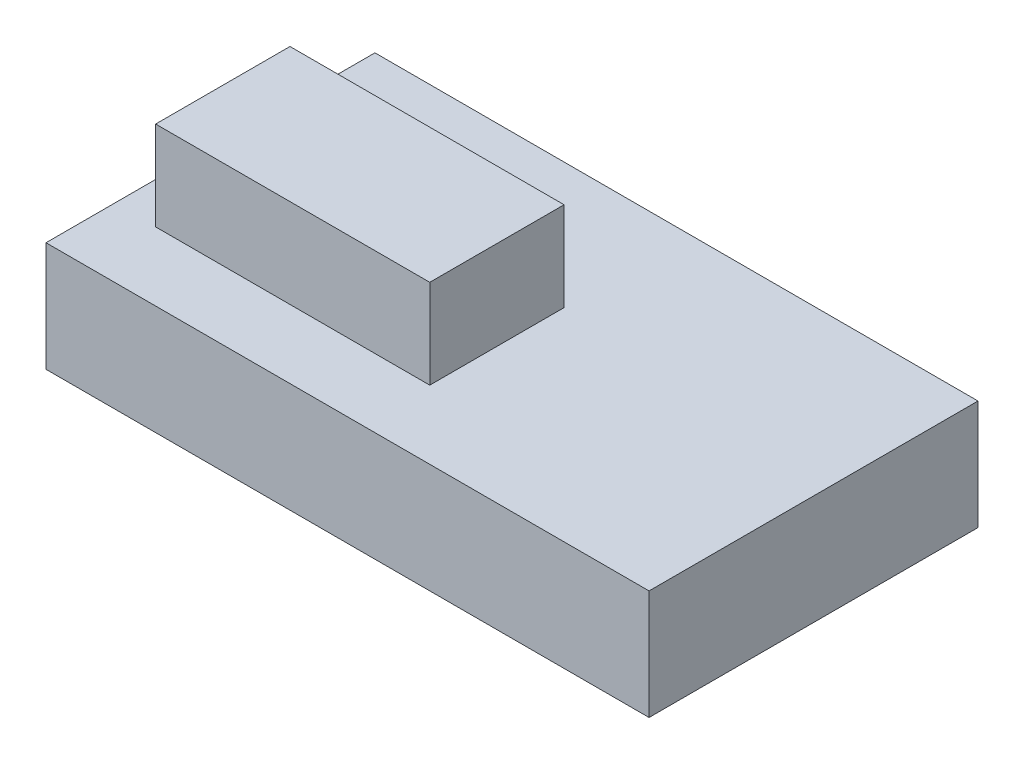
ISO-10303-21;
HEADER;
FILE_DESCRIPTION(('STEP AP214'),'2;1');
FILE_NAME('part.step','',(''),(''),'','','');
FILE_SCHEMA(('AUTOMOTIVE_DESIGN { 1 0 10303 214 1 1 1 1 }'));
ENDSEC;
DATA;
#1=APPLICATION_CONTEXT('core data for automotive mechanical design processes');
#2=APPLICATION_PROTOCOL_DEFINITION('international standard','automotive_design',2000,#1);
#3=PRODUCT_CONTEXT('',#1,'mechanical');
#4=PRODUCT('Part','Part','',(#3));
#5=PRODUCT_RELATED_PRODUCT_CATEGORY('part','',(#4));
#6=PRODUCT_DEFINITION_FORMATION('','',#4);
#7=PRODUCT_DEFINITION_CONTEXT('part definition',#1,'design');
#8=PRODUCT_DEFINITION('design','',#6,#7);
#9=PRODUCT_DEFINITION_SHAPE('','',#8);
#10=(LENGTH_UNIT() NAMED_UNIT(*) SI_UNIT(.MILLI.,.METRE.));
#11=(NAMED_UNIT(*) PLANE_ANGLE_UNIT() SI_UNIT($,.RADIAN.));
#12=(NAMED_UNIT(*) SI_UNIT($,.STERADIAN.) SOLID_ANGLE_UNIT());
#13=UNCERTAINTY_MEASURE_WITH_UNIT(LENGTH_MEASURE(1.E-05),#10,'distance_accuracy_value','');
#14=(GEOMETRIC_REPRESENTATION_CONTEXT(3) GLOBAL_UNCERTAINTY_ASSIGNED_CONTEXT((#13)) GLOBAL_UNIT_ASSIGNED_CONTEXT((#10,
#11,#12)) REPRESENTATION_CONTEXT('',''));
#15=CARTESIAN_POINT('',(0.,0.,0.));
#16=DIRECTION('',(0.,0.,1.));
#17=DIRECTION('',(1.,0.,0.));
#18=AXIS2_PLACEMENT_3D('',#15,#16,#17);
#19=CARTESIAN_POINT('',(0.,10.16,0.));
#20=DIRECTION('',(0.,1.,0.));
#21=DIRECTION('',(0.,0.,1.));
#22=AXIS2_PLACEMENT_3D('',#19,#20,#21);
#23=PLANE('',#22);
#24=DIRECTION('',(0.,0.,-1.));
#25=VECTOR('',#24,1.);
#26=CARTESIAN_POINT('',(0.,10.16,0.));
#27=LINE('',#26,#25);
#28=CARTESIAN_POINT('',(0.,10.16,0.));
#29=VERTEX_POINT('',#28);
#30=CARTESIAN_POINT('',(0.,10.16,-30.48));
#31=VERTEX_POINT('',#30);
#32=EDGE_CURVE('E150',#29,#31,#27,.T.);
#33=ORIENTED_EDGE('',*,*,#32,.T.);
#34=DIRECTION('',(-1.,0.,0.));
#35=VECTOR('',#34,1.);
#36=CARTESIAN_POINT('',(0.,10.16,-30.48));
#37=LINE('',#36,#35);
#38=CARTESIAN_POINT('',(-55.88,10.16,-30.48));
#39=VERTEX_POINT('',#38);
#40=EDGE_CURVE('E95',#31,#39,#37,.T.);
#41=ORIENTED_EDGE('',*,*,#40,.T.);
#42=DIRECTION('',(0.,0.,1.));
#43=VECTOR('',#42,1.);
#44=CARTESIAN_POINT('',(-55.88,10.16,0.));
#45=LINE('',#44,#43);
#46=CARTESIAN_POINT('',(-55.88,10.16,0.));
#47=VERTEX_POINT('',#46);
#48=EDGE_CURVE('E153',#39,#47,#45,.T.);
#49=ORIENTED_EDGE('',*,*,#48,.T.);
#50=DIRECTION('',(1.,0.,0.));
#51=VECTOR('',#50,1.);
#52=CARTESIAN_POINT('',(0.,10.16,0.));
#53=LINE('',#52,#51);
#54=EDGE_CURVE('E67',#47,#29,#53,.T.);
#55=ORIENTED_EDGE('',*,*,#54,.T.);
#56=EDGE_LOOP('',(#33,#41,#49,#55));
#57=FACE_BOUND('',#56,.T.);
#58=DIRECTION('',(1.,0.,0.));
#59=VECTOR('',#58,1.);
#60=CARTESIAN_POINT('',(-52.07,10.16,-6.34999999999999));
#61=LINE('',#60,#59);
#62=CARTESIAN_POINT('',(-52.07,10.16,-6.34999999999999));
#63=VERTEX_POINT('',#62);
#64=CARTESIAN_POINT('',(-26.67,10.16,-6.34999999999999));
#65=VERTEX_POINT('',#64);
#66=EDGE_CURVE('E317',#63,#65,#61,.T.);
#67=ORIENTED_EDGE('',*,*,#66,.F.);
#68=DIRECTION('',(0.,0.,1.));
#69=VECTOR('',#68,1.);
#70=CARTESIAN_POINT('',(-52.07,10.16,-6.34999999999999));
#71=LINE('',#70,#69);
#72=CARTESIAN_POINT('',(-52.07,10.16,-18.796));
#73=VERTEX_POINT('',#72);
#74=EDGE_CURVE('E140',#73,#63,#71,.T.);
#75=ORIENTED_EDGE('',*,*,#74,.F.);
#76=DIRECTION('',(-1.,0.,0.));
#77=VECTOR('',#76,1.);
#78=CARTESIAN_POINT('',(-52.07,10.16,-18.796));
#79=LINE('',#78,#77);
#80=CARTESIAN_POINT('',(-26.67,10.16,-18.796));
#81=VERTEX_POINT('',#80);
#82=EDGE_CURVE('E136',#81,#73,#79,.T.);
#83=ORIENTED_EDGE('',*,*,#82,.F.);
#84=DIRECTION('',(0.,0.,-1.));
#85=VECTOR('',#84,1.);
#86=CARTESIAN_POINT('',(-26.67,10.16,-6.34999999999999));
#87=LINE('',#86,#85);
#88=EDGE_CURVE('E314',#65,#81,#87,.T.);
#89=ORIENTED_EDGE('',*,*,#88,.F.);
#90=EDGE_LOOP('',(#67,#75,#83,#89));
#91=FACE_BOUND('',#90,.T.);
#92=ADVANCED_FACE('F43',(#57,#91),#23,.T.);
#93=CARTESIAN_POINT('',(0.,10.16,0.));
#94=DIRECTION('',(-1.,0.,0.));
#95=DIRECTION('',(0.,0.,1.));
#96=AXIS2_PLACEMENT_3D('',#93,#94,#95);
#97=PLANE('',#96);
#98=DIRECTION('',(0.,0.,-1.));
#99=VECTOR('',#98,1.);
#100=CARTESIAN_POINT('',(0.,0.,0.));
#101=LINE('',#100,#99);
#102=CARTESIAN_POINT('',(0.,0.,0.));
#103=VERTEX_POINT('',#102);
#104=CARTESIAN_POINT('',(0.,0.,-30.48));
#105=VERTEX_POINT('',#104);
#106=EDGE_CURVE('E142',#103,#105,#101,.T.);
#107=ORIENTED_EDGE('',*,*,#106,.T.);
#108=DIRECTION('',(0.,-1.,0.));
#109=VECTOR('',#108,1.);
#110=CARTESIAN_POINT('',(0.,10.16,-30.48));
#111=LINE('',#110,#109);
#112=EDGE_CURVE('E11',#31,#105,#111,.T.);
#113=ORIENTED_EDGE('',*,*,#112,.F.);
#114=ORIENTED_EDGE('',*,*,#32,.F.);
#115=DIRECTION('',(0.,-1.,0.));
#116=VECTOR('',#115,1.);
#117=CARTESIAN_POINT('',(0.,10.16,0.));
#118=LINE('',#117,#116);
#119=EDGE_CURVE('E155',#29,#103,#118,.T.);
#120=ORIENTED_EDGE('',*,*,#119,.T.);
#121=EDGE_LOOP('',(#107,#113,#114,#120));
#122=FACE_BOUND('',#121,.T.);
#123=ADVANCED_FACE('F45',(#122),#97,.F.);
#124=CARTESIAN_POINT('',(0.,10.16,-30.48));
#125=DIRECTION('',(0.,0.,1.));
#126=DIRECTION('',(1.,0.,0.));
#127=AXIS2_PLACEMENT_3D('',#124,#125,#126);
#128=PLANE('',#127);
#129=DIRECTION('',(-1.,0.,0.));
#130=VECTOR('',#129,1.);
#131=CARTESIAN_POINT('',(0.,0.,-30.48));
#132=LINE('',#131,#130);
#133=CARTESIAN_POINT('',(-55.88,0.,-30.48));
#134=VERTEX_POINT('',#133);
#135=EDGE_CURVE('E145',#105,#134,#132,.T.);
#136=ORIENTED_EDGE('',*,*,#135,.T.);
#137=DIRECTION('',(0.,-1.,0.));
#138=VECTOR('',#137,1.);
#139=CARTESIAN_POINT('',(-55.88,10.16,-30.48));
#140=LINE('',#139,#138);
#141=EDGE_CURVE('E51',#39,#134,#140,.T.);
#142=ORIENTED_EDGE('',*,*,#141,.F.);
#143=ORIENTED_EDGE('',*,*,#40,.F.);
#144=ORIENTED_EDGE('',*,*,#112,.T.);
#145=EDGE_LOOP('',(#136,#142,#143,#144));
#146=FACE_BOUND('',#145,.T.);
#147=ADVANCED_FACE('F183',(#146),#128,.F.);
#148=CARTESIAN_POINT('',(-55.88,10.16,0.));
#149=DIRECTION('',(1.,0.,0.));
#150=DIRECTION('',(0.,0.,-1.));
#151=AXIS2_PLACEMENT_3D('',#148,#149,#150);
#152=PLANE('',#151);
#153=DIRECTION('',(0.,0.,1.));
#154=VECTOR('',#153,1.);
#155=CARTESIAN_POINT('',(-55.88,0.,0.));
#156=LINE('',#155,#154);
#157=CARTESIAN_POINT('',(-55.88,0.,0.));
#158=VERTEX_POINT('',#157);
#159=EDGE_CURVE('E158',#134,#158,#156,.T.);
#160=ORIENTED_EDGE('',*,*,#159,.T.);
#161=DIRECTION('',(0.,-1.,0.));
#162=VECTOR('',#161,1.);
#163=CARTESIAN_POINT('',(-55.88,10.16,0.));
#164=LINE('',#163,#162);
#165=EDGE_CURVE('E162',#47,#158,#164,.T.);
#166=ORIENTED_EDGE('',*,*,#165,.F.);
#167=ORIENTED_EDGE('',*,*,#48,.F.);
#168=ORIENTED_EDGE('',*,*,#141,.T.);
#169=EDGE_LOOP('',(#160,#166,#167,#168));
#170=FACE_BOUND('',#169,.T.);
#171=ADVANCED_FACE('F167',(#170),#152,.F.);
#172=CARTESIAN_POINT('',(0.,10.16,0.));
#173=DIRECTION('',(0.,0.,-1.));
#174=DIRECTION('',(-1.,0.,0.));
#175=AXIS2_PLACEMENT_3D('',#172,#173,#174);
#176=PLANE('',#175);
#177=DIRECTION('',(1.,0.,0.));
#178=VECTOR('',#177,1.);
#179=CARTESIAN_POINT('',(0.,0.,0.));
#180=LINE('',#179,#178);
#181=EDGE_CURVE('E88',#158,#103,#180,.T.);
#182=ORIENTED_EDGE('',*,*,#181,.T.);
#183=ORIENTED_EDGE('',*,*,#119,.F.);
#184=ORIENTED_EDGE('',*,*,#54,.F.);
#185=ORIENTED_EDGE('',*,*,#165,.T.);
#186=EDGE_LOOP('',(#182,#183,#184,#185));
#187=FACE_BOUND('',#186,.T.);
#188=ADVANCED_FACE('F175',(#187),#176,.F.);
#189=CARTESIAN_POINT('',(0.,0.,0.));
#190=DIRECTION('',(0.,1.,0.));
#191=DIRECTION('',(0.,0.,1.));
#192=AXIS2_PLACEMENT_3D('',#189,#190,#191);
#193=PLANE('',#192);
#194=ORIENTED_EDGE('',*,*,#106,.F.);
#195=ORIENTED_EDGE('',*,*,#181,.F.);
#196=ORIENTED_EDGE('',*,*,#159,.F.);
#197=ORIENTED_EDGE('',*,*,#135,.F.);
#198=EDGE_LOOP('',(#194,#195,#196,#197));
#199=FACE_BOUND('',#198,.T.);
#200=ADVANCED_FACE('F171',(#199),#193,.F.);
#201=CARTESIAN_POINT('',(-52.07,18.415,-6.34999999999999));
#202=DIRECTION('',(1.,0.,0.));
#203=DIRECTION('',(0.,0.,-1.));
#204=AXIS2_PLACEMENT_3D('',#201,#202,#203);
#205=PLANE('',#204);
#206=ORIENTED_EDGE('',*,*,#74,.T.);
#207=DIRECTION('',(0.,-1.,0.));
#208=VECTOR('',#207,1.);
#209=CARTESIAN_POINT('',(-52.07,18.415,-6.34999999999999));
#210=LINE('',#209,#208);
#211=CARTESIAN_POINT('',(-52.07,18.415,-6.34999999999999));
#212=VERTEX_POINT('',#211);
#213=EDGE_CURVE('E121',#212,#63,#210,.T.);
#214=ORIENTED_EDGE('',*,*,#213,.F.);
#215=DIRECTION('',(0.,0.,1.));
#216=VECTOR('',#215,1.);
#217=CARTESIAN_POINT('',(-52.07,18.415,-6.34999999999999));
#218=LINE('',#217,#216);
#219=CARTESIAN_POINT('',(-52.07,18.415,-18.796));
#220=VERTEX_POINT('',#219);
#221=EDGE_CURVE('E128',#220,#212,#218,.T.);
#222=ORIENTED_EDGE('',*,*,#221,.F.);
#223=DIRECTION('',(0.,-1.,0.));
#224=VECTOR('',#223,1.);
#225=CARTESIAN_POINT('',(-52.07,18.415,-18.796));
#226=LINE('',#225,#224);
#227=EDGE_CURVE('E312',#220,#73,#226,.T.);
#228=ORIENTED_EDGE('',*,*,#227,.T.);
#229=EDGE_LOOP('',(#206,#214,#222,#228));
#230=FACE_BOUND('',#229,.T.);
#231=ADVANCED_FACE('F138',(#230),#205,.F.);
#232=CARTESIAN_POINT('',(-52.07,18.415,-6.34999999999999));
#233=DIRECTION('',(0.,0.,-1.));
#234=DIRECTION('',(-1.,0.,0.));
#235=AXIS2_PLACEMENT_3D('',#232,#233,#234);
#236=PLANE('',#235);
#237=ORIENTED_EDGE('',*,*,#66,.T.);
#238=DIRECTION('',(0.,-1.,0.));
#239=VECTOR('',#238,1.);
#240=CARTESIAN_POINT('',(-26.67,18.415,-6.34999999999999));
#241=LINE('',#240,#239);
#242=CARTESIAN_POINT('',(-26.67,18.415,-6.34999999999999));
#243=VERTEX_POINT('',#242);
#244=EDGE_CURVE('E124',#243,#65,#241,.T.);
#245=ORIENTED_EDGE('',*,*,#244,.F.);
#246=DIRECTION('',(1.,0.,0.));
#247=VECTOR('',#246,1.);
#248=CARTESIAN_POINT('',(-52.07,18.415,-6.34999999999999));
#249=LINE('',#248,#247);
#250=EDGE_CURVE('E117',#212,#243,#249,.T.);
#251=ORIENTED_EDGE('',*,*,#250,.F.);
#252=ORIENTED_EDGE('',*,*,#213,.T.);
#253=EDGE_LOOP('',(#237,#245,#251,#252));
#254=FACE_BOUND('',#253,.T.);
#255=ADVANCED_FACE('F119',(#254),#236,.F.);
#256=CARTESIAN_POINT('',(-26.67,18.415,-6.34999999999999));
#257=DIRECTION('',(-1.,0.,0.));
#258=DIRECTION('',(0.,0.,1.));
#259=AXIS2_PLACEMENT_3D('',#256,#257,#258);
#260=PLANE('',#259);
#261=ORIENTED_EDGE('',*,*,#88,.T.);
#262=DIRECTION('',(0.,-1.,0.));
#263=VECTOR('',#262,1.);
#264=CARTESIAN_POINT('',(-26.67,18.415,-18.796));
#265=LINE('',#264,#263);
#266=CARTESIAN_POINT('',(-26.67,18.415,-18.796));
#267=VERTEX_POINT('',#266);
#268=EDGE_CURVE('E58',#267,#81,#265,.T.);
#269=ORIENTED_EDGE('',*,*,#268,.F.);
#270=DIRECTION('',(0.,0.,-1.));
#271=VECTOR('',#270,1.);
#272=CARTESIAN_POINT('',(-26.67,18.415,-6.34999999999999));
#273=LINE('',#272,#271);
#274=EDGE_CURVE('E127',#243,#267,#273,.T.);
#275=ORIENTED_EDGE('',*,*,#274,.F.);
#276=ORIENTED_EDGE('',*,*,#244,.T.);
#277=EDGE_LOOP('',(#261,#269,#275,#276));
#278=FACE_BOUND('',#277,.T.);
#279=ADVANCED_FACE('F196',(#278),#260,.F.);
#280=CARTESIAN_POINT('',(-52.07,18.415,-18.796));
#281=DIRECTION('',(0.,0.,1.));
#282=DIRECTION('',(1.,0.,0.));
#283=AXIS2_PLACEMENT_3D('',#280,#281,#282);
#284=PLANE('',#283);
#285=ORIENTED_EDGE('',*,*,#82,.T.);
#286=ORIENTED_EDGE('',*,*,#227,.F.);
#287=DIRECTION('',(-1.,0.,0.));
#288=VECTOR('',#287,1.);
#289=CARTESIAN_POINT('',(-52.07,18.415,-18.796));
#290=LINE('',#289,#288);
#291=EDGE_CURVE('E132',#267,#220,#290,.T.);
#292=ORIENTED_EDGE('',*,*,#291,.F.);
#293=ORIENTED_EDGE('',*,*,#268,.T.);
#294=EDGE_LOOP('',(#285,#286,#292,#293));
#295=FACE_BOUND('',#294,.T.);
#296=ADVANCED_FACE('F199',(#295),#284,.F.);
#297=CARTESIAN_POINT('',(0.,18.415,0.));
#298=DIRECTION('',(0.,-1.,0.));
#299=DIRECTION('',(0.,0.,-1.));
#300=AXIS2_PLACEMENT_3D('',#297,#298,#299);
#301=PLANE('',#300);
#302=ORIENTED_EDGE('',*,*,#221,.T.);
#303=ORIENTED_EDGE('',*,*,#250,.T.);
#304=ORIENTED_EDGE('',*,*,#274,.T.);
#305=ORIENTED_EDGE('',*,*,#291,.T.);
#306=EDGE_LOOP('',(#302,#303,#304,#305));
#307=FACE_BOUND('',#306,.T.);
#308=ADVANCED_FACE('F131',(#307),#301,.F.);
#309=CLOSED_SHELL('',(#92,#123,#147,#171,#188,#200,#231,#255,#279,#296,#308));
#310=MANIFOLD_SOLID_BREP('B2',#309);
#311=ADVANCED_BREP_SHAPE_REPRESENTATION('',(#18,#310),#14);
#312=SHAPE_DEFINITION_REPRESENTATION(#9,#311);
ENDSEC;
END-ISO-10303-21;
